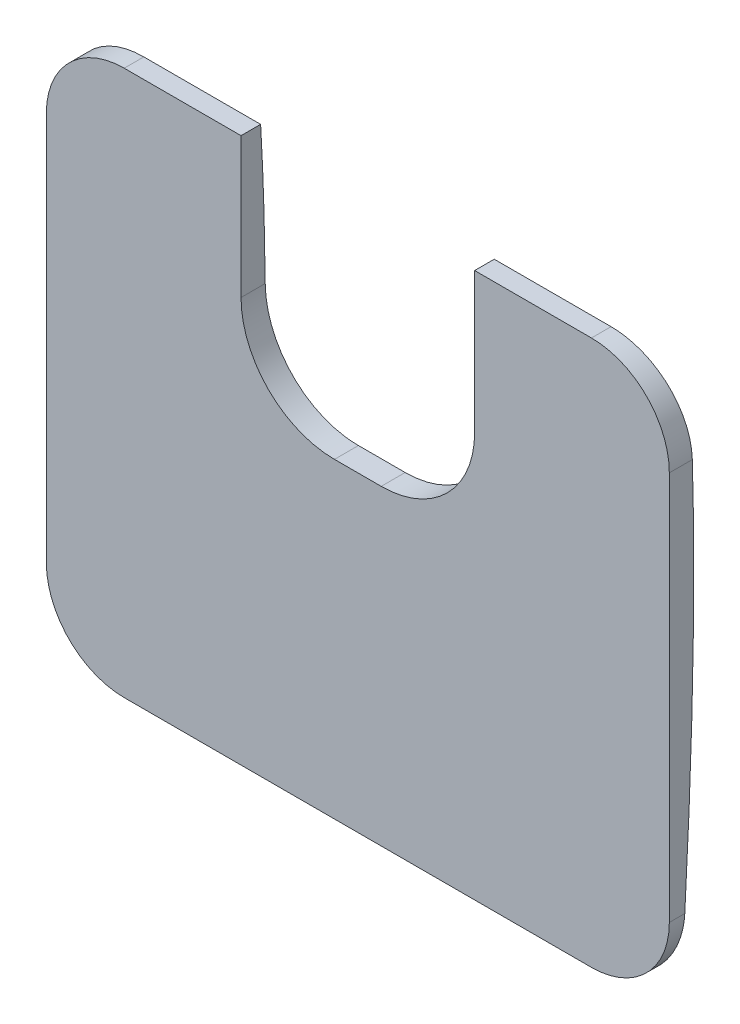
ISO-10303-21;
HEADER;
FILE_DESCRIPTION(('STEP AP214'),'2;1');
FILE_NAME('part.step','',(''),(''),'','','');
FILE_SCHEMA(('AUTOMOTIVE_DESIGN { 1 0 10303 214 1 1 1 1 }'));
ENDSEC;
DATA;
#1=APPLICATION_CONTEXT('core data for automotive mechanical design processes');
#2=APPLICATION_PROTOCOL_DEFINITION('international standard','automotive_design',2000,#1);
#3=PRODUCT_CONTEXT('',#1,'mechanical');
#4=PRODUCT('Part','Part','',(#3));
#5=PRODUCT_RELATED_PRODUCT_CATEGORY('part','',(#4));
#6=PRODUCT_DEFINITION_FORMATION('','',#4);
#7=PRODUCT_DEFINITION_CONTEXT('part definition',#1,'design');
#8=PRODUCT_DEFINITION('design','',#6,#7);
#9=PRODUCT_DEFINITION_SHAPE('','',#8);
#10=(LENGTH_UNIT() NAMED_UNIT(*) SI_UNIT(.MILLI.,.METRE.));
#11=(NAMED_UNIT(*) PLANE_ANGLE_UNIT() SI_UNIT($,.RADIAN.));
#12=(NAMED_UNIT(*) SI_UNIT($,.STERADIAN.) SOLID_ANGLE_UNIT());
#13=UNCERTAINTY_MEASURE_WITH_UNIT(LENGTH_MEASURE(1.E-05),#10,'distance_accuracy_value','');
#14=(GEOMETRIC_REPRESENTATION_CONTEXT(3) GLOBAL_UNCERTAINTY_ASSIGNED_CONTEXT((#13)) GLOBAL_UNIT_ASSIGNED_CONTEXT((#10,
#11,#12)) REPRESENTATION_CONTEXT('',''));
#15=CARTESIAN_POINT('',(0.,0.,0.));
#16=DIRECTION('',(0.,0.,1.));
#17=DIRECTION('',(1.,0.,0.));
#18=AXIS2_PLACEMENT_3D('',#15,#16,#17);
#19=CARTESIAN_POINT('',(291.807940561402,15.696584156694,-5.));
#20=DIRECTION('',(0.,1.,0.));
#21=DIRECTION('',(0.,0.,1.));
#22=AXIS2_PLACEMENT_3D('',#19,#20,#21);
#23=PLANE('',#22);
#24=DIRECTION('',(0.,0.,1.));
#25=VECTOR('',#24,1.);
#26=CARTESIAN_POINT('',(314.307940561431,15.696584156694,-26.2132034355964));
#27=LINE('',#26,#25);
#28=CARTESIAN_POINT('',(314.307940561439,15.6965841566943,-4.25834069246658));
#29=VERTEX_POINT('',#28);
#30=CARTESIAN_POINT('',(314.307940561431,15.696584156694,-3.));
#31=VERTEX_POINT('',#30);
#32=EDGE_CURVE('E153',#29,#31,#27,.T.);
#33=ORIENTED_EDGE('',*,*,#32,.T.);
#34=DIRECTION('',(-1.,-8.79666709847979E-12,0.));
#35=VECTOR('',#34,1.);
#36=CARTESIAN_POINT('',(321.807940561402,15.69658415676,-3.));
#37=LINE('',#36,#35);
#38=CARTESIAN_POINT('',(321.807940561402,15.696584156793,-3.));
#39=VERTEX_POINT('',#38);
#40=EDGE_CURVE('E136',#39,#31,#37,.T.);
#41=ORIENTED_EDGE('',*,*,#40,.F.);
#42=DIRECTION('',(0.,0.,1.));
#43=VECTOR('',#42,1.);
#44=CARTESIAN_POINT('',(321.807940561402,15.696584156694,-5.));
#45=LINE('',#44,#43);
#46=CARTESIAN_POINT('',(321.807940561402,15.6965841566951,-4.25834069246929));
#47=VERTEX_POINT('',#46);
#48=EDGE_CURVE('E173',#47,#39,#45,.T.);
#49=ORIENTED_EDGE('',*,*,#48,.F.);
#50=DIRECTION('',(1.,0.,-3.63875596320897E-13));
#51=VECTOR('',#50,1.);
#52=CARTESIAN_POINT('',(306.807940561462,15.6965841566941,-4.25834069246383));
#53=LINE('',#52,#51);
#54=EDGE_CURVE('E159',#47,#29,#53,.F.);
#55=ORIENTED_EDGE('',*,*,#54,.T.);
#56=EDGE_LOOP('',(#33,#41,#49,#55));
#57=FACE_BOUND('',#56,.T.);
#58=ADVANCED_FACE('F35',(#57),#23,.T.);
#59=DIRECTION('',(0.,0.,1.));
#60=VECTOR('',#59,1.);
#61=CARTESIAN_POINT('',(291.807940561402,15.696584156694,-5.));
#62=LINE('',#61,#60);
#63=CARTESIAN_POINT('',(291.807940561402,15.6965841566931,-4.25834069245837));
#64=VERTEX_POINT('',#63);
#65=CARTESIAN_POINT('',(291.807940561402,15.696584156694,-3.));
#66=VERTEX_POINT('',#65);
#67=EDGE_CURVE('E46',#64,#66,#62,.T.);
#68=ORIENTED_EDGE('',*,*,#67,.T.);
#69=DIRECTION('',(-1.,0.,0.));
#70=VECTOR('',#69,1.);
#71=CARTESIAN_POINT('',(299.307940561431,15.696584156694,-3.));
#72=LINE('',#71,#70);
#73=CARTESIAN_POINT('',(299.307940561431,15.696584156694,-3.));
#74=VERTEX_POINT('',#73);
#75=EDGE_CURVE('E221',#74,#66,#72,.T.);
#76=ORIENTED_EDGE('',*,*,#75,.F.);
#77=DIRECTION('',(0.,0.,1.));
#78=VECTOR('',#77,1.);
#79=CARTESIAN_POINT('',(299.307940561431,15.696584156694,-26.2132034355964));
#80=LINE('',#79,#78);
#81=CARTESIAN_POINT('',(299.307940561431,15.696584156694,-4.25834069246106));
#82=VERTEX_POINT('',#81);
#83=EDGE_CURVE('E160',#82,#74,#80,.T.);
#84=ORIENTED_EDGE('',*,*,#83,.F.);
#85=DIRECTION('',(1.,0.,-3.63875596320897E-13));
#86=VECTOR('',#85,1.);
#87=CARTESIAN_POINT('',(306.807940561462,15.6965841566941,-4.25834069246383));
#88=LINE('',#87,#86);
#89=EDGE_CURVE('E60',#82,#64,#88,.F.);
#90=ORIENTED_EDGE('',*,*,#89,.T.);
#91=EDGE_LOOP('',(#68,#76,#84,#90));
#92=FACE_BOUND('',#91,.T.);
#93=ADVANCED_FACE('F310',(#92),#23,.T.);
#94=CARTESIAN_POINT('',(321.807940561265,10.6965841566941,-5.));
#95=DIRECTION('',(0.,0.,1.));
#96=DIRECTION('',(1.,0.,0.));
#97=AXIS2_PLACEMENT_3D('',#94,#95,#96);
#98=CYLINDRICAL_SURFACE('',#97,4.99999999999995);
#99=ORIENTED_EDGE('',*,*,#48,.T.);
#100=CARTESIAN_POINT('',(321.807940561265,10.6965841566941,-3.));
#101=DIRECTION('',(0.,0.,1.));
#102=DIRECTION('',(1.,0.,0.));
#103=AXIS2_PLACEMENT_3D('',#100,#101,#102);
#104=CIRCLE('',#103,5.00000000009891);
#105=CARTESIAN_POINT('',(326.807940561397,10.6965841565873,-3.));
#106=VERTEX_POINT('',#105);
#107=EDGE_CURVE('E142',#106,#39,#104,.T.);
#108=ORIENTED_EDGE('',*,*,#107,.F.);
#109=DIRECTION('',(0.,0.,1.));
#110=VECTOR('',#109,1.);
#111=CARTESIAN_POINT('',(326.807940561397,10.6965841565873,-5.));
#112=LINE('',#111,#110);
#113=CARTESIAN_POINT('',(326.807940561397,10.6965841565873,-4.47610932860178));
#114=VERTEX_POINT('',#113);
#115=EDGE_CURVE('E175',#114,#106,#112,.T.);
#116=ORIENTED_EDGE('',*,*,#115,.F.);
#117=CARTESIAN_POINT('',(326.807940561265,10.6965841565873,-4.47610932860179));
#118=CARTESIAN_POINT('',(326.807955681955,10.8373025921257,-4.47200247518613));
#119=CARTESIAN_POINT('',(326.802000697937,10.9780139935325,-4.46773641662479));
#120=CARTESIAN_POINT('',(326.778262179565,11.2584195482503,-4.4589198899167));
#121=CARTESIAN_POINT('',(326.760479256061,11.3981137537176,-4.45436943646846));
#122=CARTESIAN_POINT('',(326.713214758485,11.6753893420703,-4.44502130149415));
#123=CARTESIAN_POINT('',(326.683742231802,11.8129722736781,-4.44022381365795));
#124=CARTESIAN_POINT('',(326.613314757692,12.085157882331,-4.43042339593424));
#125=CARTESIAN_POINT('',(326.572359938321,12.2197605925952,-4.42542046833843));
#126=CARTESIAN_POINT('',(326.479245446464,12.485070090166,-4.41526044287359));
#127=CARTESIAN_POINT('',(326.427082587139,12.6157757573454,-4.41010330151596));
#128=CARTESIAN_POINT('',(326.311909297627,12.8723711912107,-4.39969504037403));
#129=CARTESIAN_POINT('',(326.248894878895,12.9982591662617,-4.39444388667318));
#130=CARTESIAN_POINT('',(326.112515337006,13.2442102186557,-4.38391976882029));
#131=CARTESIAN_POINT('',(326.039155655271,13.3642763138712,-4.3786468175397));
#132=CARTESIAN_POINT('',(325.88255354035,13.5978434288808,-4.36814751137418));
#133=CARTESIAN_POINT('',(325.799307680356,13.7113421518598,-4.36292117332545));
#134=CARTESIAN_POINT('',(325.623529279272,13.9309413435465,-4.35259313122389));
#135=CARTESIAN_POINT('',(325.530995229563,14.0370406056509,-4.34749144758571));
#136=CARTESIAN_POINT('',(325.337307558281,14.2410663413398,-4.33749297384899));
#137=CARTESIAN_POINT('',(325.236153940331,14.3389928183599,-4.33259618366433));
#138=CARTESIAN_POINT('',(325.025905162658,14.5260104941886,-4.32308493897687));
#139=CARTESIAN_POINT('',(324.916807089316,14.6150984228844,-4.31847058921231));
#140=CARTESIAN_POINT('',(324.691516043764,14.7837328082437,-4.3096055480908));
#141=CARTESIAN_POINT('',(324.575325557532,14.8632825794963,-4.30535473055148));
#142=CARTESIAN_POINT('',(324.336631710137,15.0123133029844,-4.29728900304789));
#143=CARTESIAN_POINT('',(324.214127931951,15.0817935889249,-4.29347412193294));
#144=CARTESIAN_POINT('',(323.963732991553,15.2101578040201,-4.2863506664779));
#145=CARTESIAN_POINT('',(323.835843814635,15.2690455965548,-4.28304190760694));
#146=CARTESIAN_POINT('',(323.575578605425,15.3758180351717,-4.27699107311555));
#147=CARTESIAN_POINT('',(323.443203938469,15.4237059955723,-4.27424882682644));
#148=CARTESIAN_POINT('',(323.174931220594,15.5081451773676,-4.26938204659243));
#149=CARTESIAN_POINT('',(323.039034036675,15.5446991602314,-4.26725736218945));
#150=CARTESIAN_POINT('',(322.722347553336,15.6156939850449,-4.26311303103576));
#151=CARTESIAN_POINT('',(322.540607590983,15.6460262548773,-4.26132672180894));
#152=CARTESIAN_POINT('',(322.266542287529,15.6763571769092,-4.25953711124066));
#153=CARTESIAN_POINT('',(322.174990489759,15.6839395636655,-4.25908888534154));
#154=CARTESIAN_POINT('',(321.991613445475,15.6940524529484,-4.25849061029251));
#155=CARTESIAN_POINT('',(321.899788217687,15.6965832937884,-4.2583405411744));
#156=CARTESIAN_POINT('',(321.807940561402,15.696584156694,-4.25834069246935));
#157=B_SPLINE_CURVE_WITH_KNOTS('',3,(#117,#118,#119,#120,#121,#122,#123,#124,#125,#126,#127,
#128,#129,#130,#131,#132,#133,#134,#135,#136,#137,#138,#139,#140,#141,#142,#143,#144,#145,#146,
#147,#148,#149,#150,#151,#152,#153,#154,#155,#156),.UNSPECIFIED.,.F.,.F.,(4,2,2,2,2,2,2,2,2,2,2,
2,2,2,2,2,2,2,2,4),(0.,0.422205697908129,0.844389592788697,1.26624736611067,1.68810043482523,
2.11007361019863,2.53220221626082,2.95410961269885,3.3761636824142,3.79828641481032,
4.22040896975973,4.64268712497839,5.06481810708548,5.48697700874424,5.90898162359839,
6.33085891853793,6.7526333441844,7.30414410862671,7.57962579073973,7.85508902261871),.UNSPECIFIED.);
#158=EDGE_CURVE('E161',#114,#47,#157,.T.);
#159=ORIENTED_EDGE('',*,*,#158,.T.);
#160=EDGE_LOOP('',(#99,#108,#116,#159));
#161=FACE_BOUND('',#160,.T.);
#162=ADVANCED_FACE('F316',(#161),#98,.T.);
#163=CARTESIAN_POINT('',(326.807940561397,10.6965841565873,-5.));
#164=DIRECTION('',(1.,0.,0.));
#165=DIRECTION('',(0.,0.,-1.));
#166=AXIS2_PLACEMENT_3D('',#163,#164,#165);
#167=PLANE('',#166);
#168=ORIENTED_EDGE('',*,*,#115,.T.);
#169=DIRECTION('',(0.,1.,0.));
#170=VECTOR('',#169,1.);
#171=CARTESIAN_POINT('',(326.807940561397,-14.3034158434079,-3.));
#172=LINE('',#171,#170);
#173=CARTESIAN_POINT('',(326.807940561397,-14.3034158434079,-3.));
#174=VERTEX_POINT('',#173);
#175=EDGE_CURVE('E238',#174,#106,#172,.T.);
#176=ORIENTED_EDGE('',*,*,#175,.F.);
#177=DIRECTION('',(0.,0.,1.));
#178=VECTOR('',#177,1.);
#179=CARTESIAN_POINT('',(326.807940561397,-14.3034158434079,-5.));
#180=LINE('',#179,#178);
#181=CARTESIAN_POINT('',(326.807940561397,-14.3034158434079,-3.99279363601595));
#182=VERTEX_POINT('',#181);
#183=EDGE_CURVE('E178',#182,#174,#180,.T.);
#184=ORIENTED_EDGE('',*,*,#183,.F.);
#185=CARTESIAN_POINT('',(326.807940561401,-36.0189411442895,-2.36233348947626));
#186=CARTESIAN_POINT('',(326.807940561401,-33.8174655472411,-2.5640594077421));
#187=CARTESIAN_POINT('',(326.8079405614,-28.3807282534533,-3.03835451507526));
#188=CARTESIAN_POINT('',(326.807940561399,-19.7070258289108,-3.6921119697029));
#189=CARTESIAN_POINT('',(326.807940561398,-9.99924832097791,-4.24869143122706));
#190=CARTESIAN_POINT('',(326.807940561398,-0.295866356779825,-4.57603342067714));
#191=CARTESIAN_POINT('',(326.807940561397,7.77491004750242,-4.58425567657189));
#192=CARTESIAN_POINT('',(326.807940561397,14.2071720681441,-4.36336944783123));
#193=CARTESIAN_POINT('',(326.807940561397,19.0074377170733,-4.05350743605976));
#194=CARTESIAN_POINT('',(326.807940561396,22.975407380882,-3.64274931501332));
#195=CARTESIAN_POINT('',(326.807940561396,26.1109681812323,-3.1878234741688));
#196=CARTESIAN_POINT('',(326.807940561396,28.4294029067618,-2.76888768837752));
#197=CARTESIAN_POINT('',(326.807940561396,30.7004759910017,-2.25200999653488));
#198=CARTESIAN_POINT('',(326.807940561396,32.5183143699654,-1.71445781541652));
#199=CARTESIAN_POINT('',(326.807940561396,33.7637393630606,-1.23759557341227));
#200=CARTESIAN_POINT('',(326.807940561397,34.291166311014,-0.996644738967104));
#201=CARTESIAN_POINT('',(326.807940561397,34.4946850505463,-0.895432675926265));
#202=B_SPLINE_CURVE_WITH_KNOTS('',3,(#185,#186,#187,#188,#189,#190,#191,#192,#193,#194,#195,
#196,#197,#198,#199,#200,#201),.UNSPECIFIED.,.F.,.F.,(4,1,1,1,1,1,1,1,1,1,1,1,1,1,4),
(0.514345279864183,0.543338481354267,0.585917218611175,0.628495955868082,0.67107469312499,
0.713653430381897,0.734942799010351,0.756232167638805,0.777521536267259,0.788166220581485,
0.798810904895712,0.809455589209939,0.820100273524166,0.82542261568128,0.829038536987228),.UNSPECIFIED.);
#203=EDGE_CURVE('E167',#182,#114,#202,.T.);
#204=ORIENTED_EDGE('',*,*,#203,.T.);
#205=EDGE_LOOP('',(#168,#176,#184,#204));
#206=FACE_BOUND('',#205,.T.);
#207=ADVANCED_FACE('F323',(#206),#167,.T.);
#208=CARTESIAN_POINT('',(321.80794056143,-14.3034158434079,-5.));
#209=DIRECTION('',(0.,0.,1.));
#210=DIRECTION('',(1.,0.,0.));
#211=AXIS2_PLACEMENT_3D('',#208,#209,#210);
#212=CYLINDRICAL_SURFACE('',#211,4.99999999996626);
#213=ORIENTED_EDGE('',*,*,#183,.T.);
#214=CARTESIAN_POINT('',(321.80794056143,-14.3034158434079,-3.));
#215=DIRECTION('',(0.,0.,1.));
#216=DIRECTION('',(1.,0.,0.));
#217=AXIS2_PLACEMENT_3D('',#214,#215,#216);
#218=CIRCLE('',#217,4.99999999996626);
#219=CARTESIAN_POINT('',(321.807940561431,-19.3034158433742,-3.));
#220=VERTEX_POINT('',#219);
#221=EDGE_CURVE('E236',#220,#174,#218,.T.);
#222=ORIENTED_EDGE('',*,*,#221,.F.);
#223=DIRECTION('',(0.,0.,1.));
#224=VECTOR('',#223,1.);
#225=CARTESIAN_POINT('',(321.807940561431,-19.3034158433742,-5.));
#226=LINE('',#225,#224);
#227=CARTESIAN_POINT('',(321.807940561431,-19.3034158433731,-3.68955676077569));
#228=VERTEX_POINT('',#227);
#229=EDGE_CURVE('E181',#228,#220,#226,.T.);
#230=ORIENTED_EDGE('',*,*,#229,.F.);
#231=CARTESIAN_POINT('',(321.807940561431,-19.3034158433742,-3.68955676077562));
#232=CARTESIAN_POINT('',(321.94836098713,-19.3034311239914,-3.68955533920949));
#233=CARTESIAN_POINT('',(322.088779115145,-19.2975011181623,-3.6899447399878));
#234=CARTESIAN_POINT('',(322.368608829737,-19.273860977636,-3.69149491474282));
#235=CARTESIAN_POINT('',(322.508020469063,-19.2561514648945,-3.6926556479933));
#236=CARTESIAN_POINT('',(322.784736612698,-19.2090820707162,-3.69573695230666));
#237=CARTESIAN_POINT('',(322.922042753621,-19.1797317700553,-3.69765689850685));
#238=CARTESIAN_POINT('',(323.193688564898,-19.1095969602916,-3.70223659090465));
#239=CARTESIAN_POINT('',(323.328028268651,-19.0688125799905,-3.70489632876872));
#240=CARTESIAN_POINT('',(323.5928262627,-18.9760883357394,-3.71092957633759));
#241=CARTESIAN_POINT('',(323.723283466714,-18.9241453825308,-3.71430328370148));
#242=CARTESIAN_POINT('',(323.979400267755,-18.8094625377062,-3.72173133795077));
#243=CARTESIAN_POINT('',(324.105058073767,-18.7467186626385,-3.72578593593962));
#244=CARTESIAN_POINT('',(324.350570398726,-18.6109327341103,-3.73453200044621));
#245=CARTESIAN_POINT('',(324.470427944529,-18.5378961314698,-3.73922312982127));
#246=CARTESIAN_POINT('',(324.703607409246,-18.3819928477441,-3.7491992799403));
#247=CARTESIAN_POINT('',(324.81692690136,-18.2991225510264,-3.75448451908745));
#248=CARTESIAN_POINT('',(325.03625415778,-18.1241078917265,-3.76559932814451));
#249=CARTESIAN_POINT('',(325.142257141034,-18.0319575599136,-3.77142924823507));
#250=CARTESIAN_POINT('',(325.346161583107,-17.8390483346421,-3.78357639899047));
#251=CARTESIAN_POINT('',(325.444060011119,-17.738286249074,-3.78989381026815));
#252=CARTESIAN_POINT('',(325.631006559448,-17.5289172333644,-3.80295278340061));
#253=CARTESIAN_POINT('',(325.720056130414,-17.4203115941243,-3.80969427543622));
#254=CARTESIAN_POINT('',(325.888727351489,-17.1959719712,-3.82354173596361));
#255=CARTESIAN_POINT('',(325.968345630918,-17.0802354613207,-3.83064783347035));
#256=CARTESIAN_POINT('',(326.117705749165,-16.8422538411673,-3.84517148887448));
#257=CARTESIAN_POINT('',(326.187427751512,-16.7199963160121,-3.8525896347424));
#258=CARTESIAN_POINT('',(326.316316769331,-16.4700530415555,-3.86765736320167));
#259=CARTESIAN_POINT('',(326.375483721156,-16.3423672595277,-3.87530694718825));
#260=CARTESIAN_POINT('',(326.482820831575,-16.0825279613778,-3.89076715964966));
#261=CARTESIAN_POINT('',(326.530996086842,-15.9503765486668,-3.89857771164687));
#262=CARTESIAN_POINT('',(326.616034441386,-15.6825402338636,-3.9142936605079));
#263=CARTESIAN_POINT('',(326.65289995549,-15.5468560927921,-3.92219903674999));
#264=CARTESIAN_POINT('',(326.725157218754,-15.2283788872064,-3.94061440387321));
#265=CARTESIAN_POINT('',(326.756198733006,-15.0445705214651,-3.95113814295161));
#266=CARTESIAN_POINT('',(326.787239468751,-14.767351015527,-3.96684363805454));
#267=CARTESIAN_POINT('',(326.794999450839,-14.6747396394934,-3.97206288318052));
#268=CARTESIAN_POINT('',(326.805349342046,-14.4892323760307,-3.98246161193553));
#269=CARTESIAN_POINT('',(326.807939594775,-14.3963365079216,-3.98764109818437));
#270=CARTESIAN_POINT('',(326.807940561397,-14.3034158434079,-3.99279363601595));
#271=B_SPLINE_CURVE_WITH_KNOTS('',3,(#231,#232,#233,#234,#235,#236,#237,#238,#239,#240,#241,
#242,#243,#244,#245,#246,#247,#248,#249,#250,#251,#252,#253,#254,#255,#256,#257,#258,#259,#260,
#261,#262,#263,#264,#265,#266,#267,#268,#269,#270),.UNSPECIFIED.,.F.,.F.,(4,2,2,2,2,2,2,2,2,2,2,
2,2,2,2,2,2,2,2,4),(0.,0.421132316312632,0.842242398679262,1.26300660954154,1.68376608079933,
2.10464219007426,2.52567385512012,2.94648338241516,3.36744811431801,3.78868537574154,
4.21007945959485,4.63140434726126,5.05287936215348,5.4751876148785,5.89749841401181,
6.31961299460281,6.74163738353355,7.3004432741648,7.57956959893323,7.85867737077976),.UNSPECIFIED.);
#272=EDGE_CURVE('E331',#228,#182,#271,.T.);
#273=ORIENTED_EDGE('',*,*,#272,.T.);
#274=EDGE_LOOP('',(#213,#222,#230,#273));
#275=FACE_BOUND('',#274,.T.);
#276=ADVANCED_FACE('F326',(#275),#212,.T.);
#277=CARTESIAN_POINT('',(291.807940561431,-19.3034158433742,-5.));
#278=DIRECTION('',(0.,-1.,0.));
#279=DIRECTION('',(0.,0.,-1.));
#280=AXIS2_PLACEMENT_3D('',#277,#278,#279);
#281=PLANE('',#280);
#282=ORIENTED_EDGE('',*,*,#229,.T.);
#283=DIRECTION('',(1.,0.,0.));
#284=VECTOR('',#283,1.);
#285=CARTESIAN_POINT('',(291.807940561431,-19.3034158433742,-3.));
#286=LINE('',#285,#284);
#287=CARTESIAN_POINT('',(291.807940561431,-19.3034158433742,-3.));
#288=VERTEX_POINT('',#287);
#289=EDGE_CURVE('E234',#288,#220,#286,.T.);
#290=ORIENTED_EDGE('',*,*,#289,.F.);
#291=DIRECTION('',(0.,0.,1.));
#292=VECTOR('',#291,1.);
#293=CARTESIAN_POINT('',(291.807940561431,-19.3034158433742,-5.));
#294=LINE('',#293,#292);
#295=CARTESIAN_POINT('',(291.807940561431,-19.3034158433742,-3.68955676076484));
#296=VERTEX_POINT('',#295);
#297=EDGE_CURVE('E184',#296,#288,#294,.T.);
#298=ORIENTED_EDGE('',*,*,#297,.F.);
#299=DIRECTION('',(1.,0.,-3.63875596320897E-13));
#300=VECTOR('',#299,1.);
#301=CARTESIAN_POINT('',(306.807940561464,-19.3034158433742,-3.68955676077023));
#302=LINE('',#301,#300);
#303=EDGE_CURVE('E292',#296,#228,#302,.T.);
#304=ORIENTED_EDGE('',*,*,#303,.T.);
#305=EDGE_LOOP('',(#282,#290,#298,#304));
#306=FACE_BOUND('',#305,.T.);
#307=ADVANCED_FACE('F301',(#306),#281,.T.);
#308=CARTESIAN_POINT('',(291.80794056143,-14.3034158433337,-5.));
#309=DIRECTION('',(0.,0.,1.));
#310=DIRECTION('',(1.,0.,0.));
#311=AXIS2_PLACEMENT_3D('',#308,#309,#310);
#312=CYLINDRICAL_SURFACE('',#311,5.00000000004052);
#313=ORIENTED_EDGE('',*,*,#297,.T.);
#314=CARTESIAN_POINT('',(291.80794056143,-14.3034158433337,-3.));
#315=DIRECTION('',(0.,0.,1.));
#316=DIRECTION('',(1.,0.,0.));
#317=AXIS2_PLACEMENT_3D('',#314,#315,#316);
#318=CIRCLE('',#317,5.00000000004052);
#319=CARTESIAN_POINT('',(286.80794056139,-14.3034158433629,-3.));
#320=VERTEX_POINT('',#319);
#321=EDGE_CURVE('E232',#320,#288,#318,.T.);
#322=ORIENTED_EDGE('',*,*,#321,.F.);
#323=DIRECTION('',(0.,0.,1.));
#324=VECTOR('',#323,1.);
#325=CARTESIAN_POINT('',(286.80794056139,-14.3034158433629,-5.));
#326=LINE('',#325,#324);
#327=CARTESIAN_POINT('',(286.80794056139,-14.303415833687,-3.99279363654058));
#328=VERTEX_POINT('',#327);
#329=EDGE_CURVE('E187',#328,#320,#326,.T.);
#330=ORIENTED_EDGE('',*,*,#329,.F.);
#331=CARTESIAN_POINT('',(286.80794056139,-14.3034158433629,-3.99279363600404));
#332=CARTESIAN_POINT('',(286.807925562334,-14.4442523615923,-3.98498466726833));
#333=CARTESIAN_POINT('',(286.813890406568,-14.585082971853,-3.97711001647148));
#334=CARTESIAN_POINT('',(286.837669575156,-14.8657298767975,-3.96129106787373));
#335=CARTESIAN_POINT('',(286.855483336385,-15.0055462193656,-3.95334677340039));
#336=CARTESIAN_POINT('',(286.902833059134,-15.2830754787565,-3.93745523740906));
#337=CARTESIAN_POINT('',(286.932360551218,-15.4207898408381,-3.92950800215605));
#338=CARTESIAN_POINT('',(287.002923478264,-15.6932394681444,-3.91366945234413));
#339=CARTESIAN_POINT('',(287.043958774994,-15.8279747691329,-3.90577813711468));
#340=CARTESIAN_POINT('',(287.137262934718,-16.0935517393583,-3.8901149815633));
#341=CARTESIAN_POINT('',(287.189535234996,-16.2243922032311,-3.88234317858014));
#342=CARTESIAN_POINT('',(287.304957602125,-16.4812534271177,-3.86698586731402));
#343=CARTESIAN_POINT('',(287.368111668704,-16.607272394043,-3.85940042870711));
#344=CARTESIAN_POINT('',(287.504800973935,-16.8534754601292,-3.84449027049305));
#345=CARTESIAN_POINT('',(287.578330593902,-16.9736626703374,-3.83716541244399));
#346=CARTESIAN_POINT('',(287.735304510557,-17.20745920019,-3.82283627670485));
#347=CARTESIAN_POINT('',(287.818752240965,-17.3210662213621,-3.81583211121013));
#348=CARTESIAN_POINT('',(287.994895692875,-17.5407760387314,-3.80221658227124));
#349=CARTESIAN_POINT('',(288.087585532953,-17.6468835348678,-3.79560497323575));
#350=CARTESIAN_POINT('',(288.281601141313,-17.8509146711143,-3.78283243097442));
#351=CARTESIAN_POINT('',(288.382926896283,-17.94883832384,-3.77667149705385));
#352=CARTESIAN_POINT('',(288.593535178636,-18.1358349437969,-3.76485752195503));
#353=CARTESIAN_POINT('',(288.70282062569,-18.2249046347143,-3.75920466886024));
#354=CARTESIAN_POINT('',(288.928499089285,-18.3934827535134,-3.74846666701309));
#355=CARTESIAN_POINT('',(289.044889604807,-18.4729945169015,-3.74338132025814));
#356=CARTESIAN_POINT('',(289.283852986101,-18.6218384757771,-3.73383176821649));
#357=CARTESIAN_POINT('',(289.406418880877,-18.6911818185368,-3.72936688302561));
#358=CARTESIAN_POINT('',(289.656931832521,-18.8192708660216,-3.72109781600739));
#359=CARTESIAN_POINT('',(289.784876899454,-18.8780204479234,-3.71729339247888));
#360=CARTESIAN_POINT('',(290.045245523601,-18.984513863245,-3.71038269270915));
#361=CARTESIAN_POINT('',(290.177667684246,-19.0322610930313,-3.70727620102757));
#362=CARTESIAN_POINT('',(290.4460267243,-19.1164162569944,-3.70179221242807));
#363=CARTESIAN_POINT('',(290.581962731077,-19.1528269777446,-3.69941453636568));
#364=CARTESIAN_POINT('',(290.897865239436,-19.2232961508283,-3.6948079209061));
#365=CARTESIAN_POINT('',(291.07875668208,-19.2533398309533,-3.69283968483182));
#366=CARTESIAN_POINT('',(291.35152765847,-19.2833818190595,-3.6908706481328));
#367=CARTESIAN_POINT('',(291.442643902325,-19.2908918862931,-3.69037818970625));
#368=CARTESIAN_POINT('',(291.625146270998,-19.3009083187792,-3.68972125682674));
#369=CARTESIAN_POINT('',(291.71653237787,-19.3034150095671,-3.6895567610355));
#370=CARTESIAN_POINT('',(291.807940561431,-19.3034158433742,-3.68955676076484));
#371=B_SPLINE_CURVE_WITH_KNOTS('',3,(#331,#332,#333,#334,#335,#336,#337,#338,#339,#340,#341,
#342,#343,#344,#345,#346,#347,#348,#349,#350,#351,#352,#353,#354,#355,#356,#357,#358,#359,#360,
#361,#362,#363,#364,#365,#366,#367,#368,#369,#370),.UNSPECIFIED.,.F.,.F.,(4,2,2,2,2,2,2,2,2,2,2,
2,2,2,2,2,2,2,2,4),(0.,0.423029269431222,0.846038435633772,1.26874230722951,1.69144110150882,
2.11426937949426,2.53725340610167,2.96000924653474,3.38291187671018,3.80554708037446,
4.228181632524,4.65097199839562,5.07361438872738,5.49578993093506,5.91781064747426,
6.33970091345987,6.76148739457934,7.3103686804158,7.58453250565308,7.85867849235627),.UNSPECIFIED.);
#372=EDGE_CURVE('E284',#328,#296,#371,.T.);
#373=ORIENTED_EDGE('',*,*,#372,.T.);
#374=EDGE_LOOP('',(#313,#322,#330,#373));
#375=FACE_BOUND('',#374,.T.);
#376=ADVANCED_FACE('F296',(#375),#312,.T.);
#377=CARTESIAN_POINT('',(286.80794056139,-14.3034158433629,-5.));
#378=DIRECTION('',(-1.,0.,0.));
#379=DIRECTION('',(0.,-1.,0.));
#380=AXIS2_PLACEMENT_3D('',#377,#378,#379);
#381=PLANE('',#380);
#382=ORIENTED_EDGE('',*,*,#329,.T.);
#383=DIRECTION('',(-1.82076576038348E-13,-1.,0.));
#384=VECTOR('',#383,1.);
#385=CARTESIAN_POINT('',(286.807940561395,10.6965841566615,-3.));
#386=LINE('',#385,#384);
#387=CARTESIAN_POINT('',(286.807940561397,10.6965841566615,-3.));
#388=VERTEX_POINT('',#387);
#389=EDGE_CURVE('E230',#388,#320,#386,.T.);
#390=ORIENTED_EDGE('',*,*,#389,.F.);
#391=DIRECTION('',(0.,0.,1.));
#392=VECTOR('',#391,1.);
#393=CARTESIAN_POINT('',(286.80794056139,10.6965841566615,-5.));
#394=LINE('',#393,#392);
#395=CARTESIAN_POINT('',(286.80794056139,10.6965841566615,-4.47610932858498));
#396=VERTEX_POINT('',#395);
#397=EDGE_CURVE('E189',#396,#388,#394,.T.);
#398=ORIENTED_EDGE('',*,*,#397,.F.);
#399=CARTESIAN_POINT('',(286.807940561392,-36.0189411442922,-2.36233348946171));
#400=CARTESIAN_POINT('',(286.807940561392,-33.8174655472438,-2.56405940772755));
#401=CARTESIAN_POINT('',(286.807940561392,-28.380728253456,-3.0383545150607));
#402=CARTESIAN_POINT('',(286.807940561391,-19.7070258289135,-3.69211196968835));
#403=CARTESIAN_POINT('',(286.80794056139,-9.9992483209806,-4.2486914312125));
#404=CARTESIAN_POINT('',(286.807940561389,-0.295866356782511,-4.57603342066259));
#405=CARTESIAN_POINT('',(286.807940561389,7.77491004749974,-4.58425567655734));
#406=CARTESIAN_POINT('',(286.807940561388,14.2071720681414,-4.36336944781667));
#407=CARTESIAN_POINT('',(286.807940561388,19.0074377170706,-4.0535074360452));
#408=CARTESIAN_POINT('',(286.807940561388,22.9754073808794,-3.64274931499877));
#409=CARTESIAN_POINT('',(286.807940561388,26.1109681812296,-3.18782347415424));
#410=CARTESIAN_POINT('',(286.807940561388,28.4294029067591,-2.76888768836297));
#411=CARTESIAN_POINT('',(286.807940561388,30.700475990999,-2.25200999652033));
#412=CARTESIAN_POINT('',(286.807940561388,32.5183143699627,-1.71445781540196));
#413=CARTESIAN_POINT('',(286.807940561388,33.7637393630579,-1.23759557339772));
#414=CARTESIAN_POINT('',(286.807940561388,34.2911663110113,-0.996644738952549));
#415=CARTESIAN_POINT('',(286.807940561388,34.4946850505437,-0.895432675911709));
#416=B_SPLINE_CURVE_WITH_KNOTS('',3,(#399,#400,#401,#402,#403,#404,#405,#406,#407,#408,#409,
#410,#411,#412,#413,#414,#415),.UNSPECIFIED.,.F.,.F.,(4,1,1,1,1,1,1,1,1,1,1,1,1,1,4),
(0.514345279864183,0.543338481354267,0.585917218611175,0.628495955868082,0.67107469312499,
0.713653430381897,0.734942799010351,0.756232167638805,0.777521536267259,0.788166220581485,
0.798810904895712,0.809455589209939,0.820100273524166,0.82542261568128,0.829038536987228),.UNSPECIFIED.);
#417=EDGE_CURVE('E293',#396,#328,#416,.F.);
#418=ORIENTED_EDGE('',*,*,#417,.T.);
#419=EDGE_LOOP('',(#382,#390,#398,#418));
#420=FACE_BOUND('',#419,.T.);
#421=ADVANCED_FACE('F300',(#420),#381,.T.);
#422=CARTESIAN_POINT('',(291.807940561427,10.6965841566663,-5.));
#423=DIRECTION('',(0.,0.,1.));
#424=DIRECTION('',(1.,0.,0.));
#425=AXIS2_PLACEMENT_3D('',#422,#423,#424);
#426=CYLINDRICAL_SURFACE('',#425,5.0000000000377);
#427=ORIENTED_EDGE('',*,*,#397,.T.);
#428=CARTESIAN_POINT('',(291.807940561427,10.6965841566663,-3.));
#429=DIRECTION('',(0.,0.,1.));
#430=DIRECTION('',(1.,0.,0.));
#431=AXIS2_PLACEMENT_3D('',#428,#429,#430);
#432=CIRCLE('',#431,5.0000000000302);
#433=EDGE_CURVE('E223',#66,#388,#432,.T.);
#434=ORIENTED_EDGE('',*,*,#433,.F.);
#435=ORIENTED_EDGE('',*,*,#67,.F.);
#436=CARTESIAN_POINT('',(291.807940561402,15.696584156704,-4.25834069245773));
#437=CARTESIAN_POINT('',(291.667460444572,15.6965994116354,-4.25833827422507));
#438=CARTESIAN_POINT('',(291.526982641611,15.6906644002865,-4.25869112297151));
#439=CARTESIAN_POINT('',(291.247034103448,15.6670041200474,-4.26008985314373));
#440=CARTESIAN_POINT('',(291.10756331508,15.6492794782652,-4.26113569770802));
#441=CARTESIAN_POINT('',(290.830729483677,15.602169486965,-4.26390178869041));
#442=CARTESIAN_POINT('',(290.693364808185,15.5727936980069,-4.26562148215568));
#443=CARTESIAN_POINT('',(290.421603175338,15.5025971634338,-4.26970148425843));
#444=CARTESIAN_POINT('',(290.287206184966,15.4617765452198,-4.27206178576481));
#445=CARTESIAN_POINT('',(290.022295406995,15.3689684910397,-4.27737919900762));
#446=CARTESIAN_POINT('',(289.891782699458,15.3169779816051,-4.2803364749919));
#447=CARTESIAN_POINT('',(289.635556784327,15.2021876618635,-4.28679345062171));
#448=CARTESIAN_POINT('',(289.509845368768,15.1393838628577,-4.29029335037731));
#449=CARTESIAN_POINT('',(289.264228070374,15.0034643509508,-4.29776897386797));
#450=CARTESIAN_POINT('',(289.144319171027,14.9303540750702,-4.30174444655561));
#451=CARTESIAN_POINT('',(288.911040382865,14.7742882281926,-4.31010372212206));
#452=CARTESIAN_POINT('',(288.797672921872,14.6913290363017,-4.3144876750479));
#453=CARTESIAN_POINT('',(288.578259537707,14.5161236773043,-4.32359008130582));
#454=CARTESIAN_POINT('',(288.472218062716,14.4238719500801,-4.32830873439772));
#455=CARTESIAN_POINT('',(288.268242811372,14.2307422528196,-4.33800200036791));
#456=CARTESIAN_POINT('',(288.170312069627,14.1298610825404,-4.34297670792963));
#457=CARTESIAN_POINT('',(287.983309971183,13.9202351554808,-4.35310043985928));
#458=CARTESIAN_POINT('',(287.894237153793,13.8114917003323,-4.35824943529844));
#459=CARTESIAN_POINT('',(287.725531873513,13.5868569899373,-4.36864595292859));
#460=CARTESIAN_POINT('',(287.645902782037,13.4709632043331,-4.37389350953613));
#461=CARTESIAN_POINT('',(287.496587798291,13.2327279408307,-4.38441671790569));
#462=CARTESIAN_POINT('',(287.4269150002,13.1103782565412,-4.38969239737058));
#463=CARTESIAN_POINT('',(287.298130839467,12.8602399984893,-4.40019375845359));
#464=CARTESIAN_POINT('',(287.239019526468,12.7324513991661,-4.40541943983659));
#465=CARTESIAN_POINT('',(287.131804454094,12.472398753768,-4.41575324294306));
#466=CARTESIAN_POINT('',(287.0836954324,12.3401368821222,-4.42086141981216));
#467=CARTESIAN_POINT('',(286.998802749636,12.0720726201526,-4.43090304213641));
#468=CARTESIAN_POINT('',(286.962016637867,11.9362710028725,-4.43583652519691));
#469=CARTESIAN_POINT('',(286.890139730486,11.6183005182746,-4.44701825831081));
#470=CARTESIAN_POINT('',(286.859317950923,11.4351355382199,-4.45318498772245));
#471=CARTESIAN_POINT('',(286.828496226393,11.1588893919322,-4.46206800230606));
#472=CARTESIAN_POINT('',(286.820790816449,11.0666033928661,-4.46496648966706));
#473=CARTESIAN_POINT('',(286.810513610784,10.8817479638742,-4.47063549142784));
#474=CARTESIAN_POINT('',(286.80794148684,10.789178552449,-4.47340601399865));
#475=CARTESIAN_POINT('',(286.80794056139,10.6965841566615,-4.47610932858498));
#476=B_SPLINE_CURVE_WITH_KNOTS('',3,(#436,#437,#438,#439,#440,#441,#442,#443,#444,#445,#446,
#447,#448,#449,#450,#451,#452,#453,#454,#455,#456,#457,#458,#459,#460,#461,#462,#463,#464,#465,
#466,#467,#468,#469,#470,#471,#472,#473,#474,#475),.UNSPECIFIED.,.F.,.F.,(4,2,2,2,2,2,2,2,2,2,2,
2,2,2,2,2,2,2,2,4),(0.,0.421311302490336,0.842600196603901,1.26354410733069,1.68448333240043,
2.10553853031835,2.52674937694532,2.9477388461614,3.36888357169309,3.79028179991053,
4.21183698753748,4.63332254416081,5.05495812117617,5.4771432137871,5.89933029071985,
6.32131501423014,6.74320834028525,7.29943089490219,7.57726857755585,7.85508849463401),.UNSPECIFIED.);
#477=EDGE_CURVE('E276',#64,#396,#476,.T.);
#478=ORIENTED_EDGE('',*,*,#477,.T.);
#479=EDGE_LOOP('',(#427,#434,#435,#478));
#480=FACE_BOUND('',#479,.T.);
#481=ADVANCED_FACE('F37',(#480),#426,.T.);
#482=CARTESIAN_POINT('',(314.307940561431,15.696584156694,-26.2132034355964));
#483=DIRECTION('',(1.,0.,0.));
#484=DIRECTION('',(0.,0.,-1.));
#485=AXIS2_PLACEMENT_3D('',#482,#483,#484);
#486=PLANE('',#485);
#487=DIRECTION('',(0.,-1.,0.));
#488=VECTOR('',#487,1.);
#489=CARTESIAN_POINT('',(314.307940561431,15.696584156694,-3.));
#490=LINE('',#489,#488);
#491=CARTESIAN_POINT('',(314.307940561431,6.69658415669404,-3.));
#492=VERTEX_POINT('',#491);
#493=EDGE_CURVE('E139',#31,#492,#490,.T.);
#494=ORIENTED_EDGE('',*,*,#493,.F.);
#495=ORIENTED_EDGE('',*,*,#32,.F.);
#496=CARTESIAN_POINT('',(314.307940561443,-36.0189411442904,-2.36233348947171));
#497=CARTESIAN_POINT('',(314.307940561443,-33.817465547242,-2.56405940773755));
#498=CARTESIAN_POINT('',(314.307940561442,-28.3807282534542,-3.03835451507071));
#499=CARTESIAN_POINT('',(314.307940561441,-19.7070258289116,-3.69211196969835));
#500=CARTESIAN_POINT('',(314.30794056144,-9.99924832097875,-4.24869143122251));
#501=CARTESIAN_POINT('',(314.30794056144,-0.295866356780665,-4.57603342067259));
#502=CARTESIAN_POINT('',(314.307940561439,7.77491004750158,-4.58425567656735));
#503=CARTESIAN_POINT('',(314.307940561439,14.2071720681432,-4.36336944782668));
#504=CARTESIAN_POINT('',(314.307940561438,19.0074377170724,-4.05350743605521));
#505=CARTESIAN_POINT('',(314.307940561438,22.9754073808812,-3.64274931500878));
#506=CARTESIAN_POINT('',(314.307940561438,26.1109681812314,-3.18782347416425));
#507=CARTESIAN_POINT('',(314.307940561438,28.4294029067609,-2.76888768837297));
#508=CARTESIAN_POINT('',(314.307940561438,30.7004759910009,-2.25200999653034));
#509=CARTESIAN_POINT('',(314.307940561438,32.5183143699646,-1.71445781541197));
#510=CARTESIAN_POINT('',(314.307940561438,33.7637393630598,-1.23759557340773));
#511=CARTESIAN_POINT('',(314.307940561439,34.2911663110132,-0.996644738962556));
#512=CARTESIAN_POINT('',(314.307940561438,34.4946850505455,-0.895432675921716));
#513=B_SPLINE_CURVE_WITH_KNOTS('',3,(#496,#497,#498,#499,#500,#501,#502,#503,#504,#505,#506,
#507,#508,#509,#510,#511,#512),.UNSPECIFIED.,.F.,.F.,(4,1,1,1,1,1,1,1,1,1,1,1,1,1,4),
(0.514345279864183,0.543338481354267,0.585917218611175,0.628495955868082,0.67107469312499,
0.713653430381897,0.734942799010351,0.756232167638805,0.777521536267259,0.788166220581485,
0.798810904895712,0.809455589209939,0.820100273524166,0.82542261568128,0.829038536987228),.UNSPECIFIED.);
#514=CARTESIAN_POINT('',(314.307940561431,6.69658415669403,-4.55345325608141));
#515=VERTEX_POINT('',#514);
#516=EDGE_CURVE('E346',#515,#29,#513,.T.);
#517=ORIENTED_EDGE('',*,*,#516,.F.);
#518=DIRECTION('',(0.,0.,1.));
#519=VECTOR('',#518,1.);
#520=CARTESIAN_POINT('',(314.307940561431,6.69658415669404,-26.2132034355964));
#521=LINE('',#520,#519);
#522=EDGE_CURVE('E155',#515,#492,#521,.T.);
#523=ORIENTED_EDGE('',*,*,#522,.T.);
#524=EDGE_LOOP('',(#494,#495,#517,#523));
#525=FACE_BOUND('',#524,.T.);
#526=ADVANCED_FACE('F151',(#525),#486,.F.);
#527=CARTESIAN_POINT('',(308.307940561431,6.69658415669404,-26.2132034355964));
#528=DIRECTION('',(0.,0.,1.));
#529=DIRECTION('',(1.,0.,0.));
#530=AXIS2_PLACEMENT_3D('',#527,#528,#529);
#531=CYLINDRICAL_SURFACE('',#530,6.);
#532=CARTESIAN_POINT('',(308.307940561431,6.69658415669404,-3.));
#533=DIRECTION('',(0.,0.,-1.));
#534=DIRECTION('',(1.,0.,0.));
#535=AXIS2_PLACEMENT_3D('',#532,#533,#534);
#536=CIRCLE('',#535,6.);
#537=CARTESIAN_POINT('',(308.307940561431,0.696584156694035,-3.));
#538=VERTEX_POINT('',#537);
#539=EDGE_CURVE('E156',#492,#538,#536,.T.);
#540=ORIENTED_EDGE('',*,*,#539,.F.);
#541=ORIENTED_EDGE('',*,*,#522,.F.);
#542=CARTESIAN_POINT('',(308.307940561431,0.696584156694038,-4.53873800949188));
#543=CARTESIAN_POINT('',(308.47668969359,0.696566000603366,-4.53873661596602));
#544=CARTESIAN_POINT('',(308.645436205813,0.703702461748274,-4.53883732310639));
#545=CARTESIAN_POINT('',(308.981721694945,0.732153474511467,-4.5392328833444));
#546=CARTESIAN_POINT('',(309.149260729914,0.753467339758828,-4.53952772704331));
#547=CARTESIAN_POINT('',(309.481819073112,0.810120496195372,-4.54030121269272));
#548=CARTESIAN_POINT('',(309.646840200178,0.845449111938435,-4.5407797147363));
#549=CARTESIAN_POINT('',(309.973319211074,0.929874652394632,-4.54190095873989));
#550=CARTESIAN_POINT('',(310.134777138033,0.978971410365593,-4.54254369871085));
#551=CARTESIAN_POINT('',(310.453032768466,1.09060287369794,-4.54396760601445));
#552=CARTESIAN_POINT('',(310.609829053927,1.15314162128635,-4.54474881497456));
#553=CARTESIAN_POINT('',(310.917653148946,1.29122882044253,-4.54641722325494));
#554=CARTESIAN_POINT('',(311.068678812465,1.36678205553252,-4.54730446150981));
#555=CARTESIAN_POINT('',(311.363748011896,1.53030145873687,-4.5491459643792));
#556=CARTESIAN_POINT('',(311.507795220766,1.61826099957013,-4.55010019307252));
#557=CARTESIAN_POINT('',(311.78801909222,1.80603111943797,-4.55203356047982));
#558=CARTESIAN_POINT('',(311.92419300127,1.9058458077498,-4.55301270773822));
#559=CARTESIAN_POINT('',(312.187632259862,2.11657966014671,-4.55494897457625));
#560=CARTESIAN_POINT('',(312.314898672998,2.22749749460844,-4.55590609677659));
#561=CARTESIAN_POINT('',(312.559636408598,2.45965940195551,-4.55774958701131));
#562=CARTESIAN_POINT('',(312.677107730423,2.58090347551259,-4.55863595504109));
#563=CARTESIAN_POINT('',(312.9014617484,2.83290286853917,-4.56028837229997));
#564=CARTESIAN_POINT('',(313.008340523906,2.96366167889756,-4.56105437703967));
#565=CARTESIAN_POINT('',(313.21066467356,3.23367395084755,-4.56241592195364));
#566=CARTESIAN_POINT('',(313.306114003385,3.37292444817616,-4.5630115212042));
#567=CARTESIAN_POINT('',(313.484990954786,3.65904744406437,-4.56398528928431));
#568=CARTESIAN_POINT('',(313.568412208637,3.80592392430546,-4.56436334325874));
#569=CARTESIAN_POINT('',(313.722550914761,4.10612914819421,-4.5648572317075));
#570=CARTESIAN_POINT('',(313.793272976868,4.25945552546735,-4.56497316151135));
#571=CARTESIAN_POINT('',(313.921529761246,4.57148318117513,-4.56490371715587));
#572=CARTESIAN_POINT('',(313.979068253677,4.73018290803292,-4.56471842926));
#573=CARTESIAN_POINT('',(314.080560127263,5.05180157093265,-4.56401420670367));
#574=CARTESIAN_POINT('',(314.124516775038,5.21471948221092,-4.56349535236315));
#575=CARTESIAN_POINT('',(314.210167421409,5.59534554650608,-4.56187845747291));
#576=CARTESIAN_POINT('',(314.246831492145,5.81421782000588,-4.56064983256623));
#577=CARTESIAN_POINT('',(314.283492883086,6.14428125921884,-4.55831808520057));
#578=CARTESIAN_POINT('',(314.29265755304,6.25453924349029,-4.55745991977792));
#579=CARTESIAN_POINT('',(314.304880638409,6.47538409841525,-4.5555797375247));
#580=CARTESIAN_POINT('',(314.307939479733,6.58597094559003,-4.55455773212811));
#581=CARTESIAN_POINT('',(314.307940561431,6.69658415669403,-4.55345325608141));
#582=B_SPLINE_CURVE_WITH_KNOTS('',3,(#542,#543,#544,#545,#546,#547,#548,#549,#550,#551,#552,
#553,#554,#555,#556,#557,#558,#559,#560,#561,#562,#563,#564,#565,#566,#567,#568,#569,#570,#571,
#572,#573,#574,#575,#576,#577,#578,#579,#580,#581),.UNSPECIFIED.,.F.,.F.,(4,2,2,2,2,2,2,2,2,2,2,
2,2,2,2,2,2,2,2,4),(0.,0.5060928348584,1.01216117001826,1.51784475603247,2.02352221811669,
2.52935195900243,3.03536801771236,3.54111478606982,4.04703737277234,4.55289944657465,
5.0587615532843,5.56481020219323,6.07068320067838,6.57682303520344,7.08277876677439,
7.58858962702538,8.09427873795377,8.75850866077014,9.09029140789459,9.42205101077814),.UNSPECIFIED.);
#583=CARTESIAN_POINT('',(308.307940561431,0.696584156694116,-4.53873800949188));
#584=VERTEX_POINT('',#583);
#585=EDGE_CURVE('E269',#584,#515,#582,.T.);
#586=ORIENTED_EDGE('',*,*,#585,.F.);
#587=DIRECTION('',(0.,0.,1.));
#588=VECTOR('',#587,1.);
#589=CARTESIAN_POINT('',(308.307940561431,0.696584156694039,-26.2132034355964));
#590=LINE('',#589,#588);
#591=EDGE_CURVE('E195',#584,#538,#590,.T.);
#592=ORIENTED_EDGE('',*,*,#591,.T.);
#593=EDGE_LOOP('',(#540,#541,#586,#592));
#594=FACE_BOUND('',#593,.T.);
#595=ADVANCED_FACE('F259',(#594),#531,.F.);
#596=CARTESIAN_POINT('',(308.307940561431,0.696584156694039,-26.2132034355964));
#597=DIRECTION('',(0.,-1.,0.));
#598=DIRECTION('',(0.,0.,-1.));
#599=AXIS2_PLACEMENT_3D('',#596,#597,#598);
#600=PLANE('',#599);
#601=DIRECTION('',(-1.,0.,0.));
#602=VECTOR('',#601,1.);
#603=CARTESIAN_POINT('',(308.307940561431,0.696584156694036,-3.));
#604=LINE('',#603,#602);
#605=CARTESIAN_POINT('',(305.307940561431,0.696584156694036,-3.));
#606=VERTEX_POINT('',#605);
#607=EDGE_CURVE('E225',#538,#606,#604,.T.);
#608=ORIENTED_EDGE('',*,*,#607,.F.);
#609=ORIENTED_EDGE('',*,*,#591,.F.);
#610=DIRECTION('',(1.,0.,-3.63875596320897E-13));
#611=VECTOR('',#610,1.);
#612=CARTESIAN_POINT('',(306.807940561463,0.696584156694015,-4.53873800949134));
#613=LINE('',#612,#611);
#614=CARTESIAN_POINT('',(305.307940561431,0.696584156694039,-4.5387380094908));
#615=VERTEX_POINT('',#614);
#616=EDGE_CURVE('E353',#615,#584,#613,.T.);
#617=ORIENTED_EDGE('',*,*,#616,.F.);
#618=DIRECTION('',(0.,0.,1.));
#619=VECTOR('',#618,1.);
#620=CARTESIAN_POINT('',(305.307940561431,0.696584156694036,-26.2132034355964));
#621=LINE('',#620,#619);
#622=EDGE_CURVE('E198',#615,#606,#621,.T.);
#623=ORIENTED_EDGE('',*,*,#622,.T.);
#624=EDGE_LOOP('',(#608,#609,#617,#623));
#625=FACE_BOUND('',#624,.T.);
#626=ADVANCED_FACE('F359',(#625),#600,.F.);
#627=CARTESIAN_POINT('',(305.307940561431,6.69658415669404,-26.2132034355964));
#628=DIRECTION('',(0.,0.,1.));
#629=DIRECTION('',(1.,0.,0.));
#630=AXIS2_PLACEMENT_3D('',#627,#628,#629);
#631=CYLINDRICAL_SURFACE('',#630,6.);
#632=CARTESIAN_POINT('',(305.307940561431,6.69658415669404,-3.));
#633=DIRECTION('',(0.,0.,-1.));
#634=DIRECTION('',(1.,0.,0.));
#635=AXIS2_PLACEMENT_3D('',#632,#633,#634);
#636=CIRCLE('',#635,6.);
#637=CARTESIAN_POINT('',(299.307940561431,6.69658415669404,-3.));
#638=VERTEX_POINT('',#637);
#639=EDGE_CURVE('E53',#606,#638,#636,.T.);
#640=ORIENTED_EDGE('',*,*,#639,.F.);
#641=ORIENTED_EDGE('',*,*,#622,.F.);
#642=CARTESIAN_POINT('',(299.30794056143,6.69658415669403,-4.55345325607595));
#643=CARTESIAN_POINT('',(299.307922378057,6.52787811678967,-4.55513937479659));
#644=CARTESIAN_POINT('',(299.315055231556,6.35917271735097,-4.55663152442632));
#645=CARTESIAN_POINT('',(299.343492659612,6.02296543230952,-4.55923611042278));
#646=CARTESIAN_POINT('',(299.364796550053,5.85546348900372,-4.56034856511559));
#647=CARTESIAN_POINT('',(299.421424059296,5.52297602682783,-4.56220143850881));
#648=CARTESIAN_POINT('',(299.456736943009,5.35798868131699,-4.56294214110057));
#649=CARTESIAN_POINT('',(299.541125889003,5.03157330073894,-4.56407322887809));
#650=CARTESIAN_POINT('',(299.590201783157,4.87014522221831,-4.56446361834297));
#651=CARTESIAN_POINT('',(299.701786841374,4.551945316872,-4.56492225827259));
#652=CARTESIAN_POINT('',(299.764300056313,4.39517491042638,-4.56499041145173));
#653=CARTESIAN_POINT('',(299.902331769964,4.08739875008393,-4.56483976758128));
#654=CARTESIAN_POINT('',(299.977855050764,3.9363951409009,-4.5646208648227));
#655=CARTESIAN_POINT('',(300.141310404692,3.64136603234979,-4.56393737910708));
#656=CARTESIAN_POINT('',(300.229235859461,3.49733686581821,-4.56347292682538));
#657=CARTESIAN_POINT('',(300.41693381417,3.21714492831318,-4.56234378167848));
#658=CARTESIAN_POINT('',(300.516710422619,3.08098490984527,-4.56167901924711));
#659=CARTESIAN_POINT('',(300.727368996192,2.81756314497576,-4.56019780521542));
#660=CARTESIAN_POINT('',(300.838250117445,2.6903007236606,-4.5593813651376));
#661=CARTESIAN_POINT('',(301.070336126779,2.44556682637515,-4.55764652351678));
#662=CARTESIAN_POINT('',(301.191541017378,2.32809535279171,-4.55672812194893));
#663=CARTESIAN_POINT('',(301.443460053447,2.10373636392641,-4.55483863458841));
#664=CARTESIAN_POINT('',(301.57417769572,1.99685277509448,-4.55386752945607));
#665=CARTESIAN_POINT('',(301.844106236847,1.79451390060611,-4.55192143138645));
#666=CARTESIAN_POINT('',(301.983314174725,1.69905466474209,-4.55094643991415));
#667=CARTESIAN_POINT('',(302.2693787413,1.52013527939836,-4.5490368147553));
#668=CARTESIAN_POINT('',(302.416240792848,1.43668379912538,-4.54810221056427));
#669=CARTESIAN_POINT('',(302.716419910393,1.28248367896498,-4.54631577060614));
#670=CARTESIAN_POINT('',(302.869734611037,1.21173043348465,-4.54546390488182));
#671=CARTESIAN_POINT('',(303.181742452764,1.0834103257922,-4.54387903740334));
#672=CARTESIAN_POINT('',(303.340434048477,1.02583971105792,-4.54314600184079));
#673=CARTESIAN_POINT('',(303.662040511872,0.924282984718379,-4.54182887515351));
#674=CARTESIAN_POINT('',(303.824954355741,0.880293612720263,-4.54124474828676));
#675=CARTESIAN_POINT('',(304.205752218073,0.794527560967962,-4.5400923815757));
#676=CARTESIAN_POINT('',(304.424806680815,0.757800179491188,-4.53958694520684));
#677=CARTESIAN_POINT('',(304.755152190452,0.721074944751786,-4.53907898920414));
#678=CARTESIAN_POINT('',(304.865505698133,0.711894180838421,-4.53895137167931));
#679=CARTESIAN_POINT('',(305.086543919409,0.699649545959117,-4.53878081667203));
#680=CARTESIAN_POINT('',(305.197228609293,0.696585247115866,-4.53873787326619));
#681=CARTESIAN_POINT('',(305.307940561431,0.696584156694045,-4.53873800949079));
#682=B_SPLINE_CURVE_WITH_KNOTS('',3,(#642,#643,#644,#645,#646,#647,#648,#649,#650,#651,#652,
#653,#654,#655,#656,#657,#658,#659,#660,#661,#662,#663,#664,#665,#666,#667,#668,#669,#670,#671,
#672,#673,#674,#675,#676,#677,#678,#679,#680,#681),.UNSPECIFIED.,.F.,.F.,(4,2,2,2,2,2,2,2,2,2,2,
2,2,2,2,2,2,2,2,4),(0.,0.505988936493444,1.01195344783133,1.5175309853309,2.0231023470481,
2.5288263348593,3.03473660895212,3.54037792083048,4.04619504085187,4.55197375117292,
5.05775258479394,5.56371828657944,6.06950853162637,6.5756621279124,7.08163177191528,
7.58745720880111,8.09316111967233,8.75794963656919,9.09001191113242,9.42205095546521),.UNSPECIFIED.);
#683=CARTESIAN_POINT('',(299.307940561439,6.69658414853009,-4.55345325615744));
#684=VERTEX_POINT('',#683);
#685=EDGE_CURVE('E215',#684,#615,#682,.T.);
#686=ORIENTED_EDGE('',*,*,#685,.F.);
#687=DIRECTION('',(0.,0.,1.));
#688=VECTOR('',#687,1.);
#689=CARTESIAN_POINT('',(299.307940561431,6.69658415669404,-26.2132034355964));
#690=LINE('',#689,#688);
#691=EDGE_CURVE('E164',#684,#638,#690,.T.);
#692=ORIENTED_EDGE('',*,*,#691,.T.);
#693=EDGE_LOOP('',(#640,#641,#686,#692));
#694=FACE_BOUND('',#693,.T.);
#695=ADVANCED_FACE('F213',(#694),#631,.F.);
#696=CARTESIAN_POINT('',(299.307940561431,15.696584156694,-26.2132034355964));
#697=DIRECTION('',(-1.,0.,0.));
#698=DIRECTION('',(0.,0.,1.));
#699=AXIS2_PLACEMENT_3D('',#696,#697,#698);
#700=PLANE('',#699);
#701=DIRECTION('',(0.,1.,0.));
#702=VECTOR('',#701,1.);
#703=CARTESIAN_POINT('',(299.307940561431,6.69658415669404,-3.));
#704=LINE('',#703,#702);
#705=EDGE_CURVE('E219',#638,#74,#704,.T.);
#706=ORIENTED_EDGE('',*,*,#705,.F.);
#707=ORIENTED_EDGE('',*,*,#691,.F.);
#708=CARTESIAN_POINT('',(299.307940561443,-36.0189411442914,-2.36233348946626));
#709=CARTESIAN_POINT('',(299.307940561442,-33.817465547243,-2.56405940773209));
#710=CARTESIAN_POINT('',(299.307940561442,-28.3807282534552,-3.03835451506525));
#711=CARTESIAN_POINT('',(299.307940561441,-19.7070258289126,-3.6921119696929));
#712=CARTESIAN_POINT('',(299.30794056144,-9.99924832097976,-4.24869143121705));
#713=CARTESIAN_POINT('',(299.30794056144,-0.295866356781672,-4.57603342066714));
#714=CARTESIAN_POINT('',(299.307940561439,7.77491004750057,-4.58425567656189));
#715=CARTESIAN_POINT('',(299.307940561439,14.2071720681422,-4.36336944782122));
#716=CARTESIAN_POINT('',(299.307940561438,19.0074377170714,-4.05350743604975));
#717=CARTESIAN_POINT('',(299.307940561438,22.9754073808802,-3.64274931500332));
#718=CARTESIAN_POINT('',(299.307940561438,26.1109681812304,-3.18782347415879));
#719=CARTESIAN_POINT('',(299.307940561438,28.4294029067599,-2.76888768836752));
#720=CARTESIAN_POINT('',(299.307940561438,30.7004759909999,-2.25200999652488));
#721=CARTESIAN_POINT('',(299.307940561438,32.5183143699636,-1.71445781540651));
#722=CARTESIAN_POINT('',(299.307940561438,33.7637393630588,-1.23759557340227));
#723=CARTESIAN_POINT('',(299.307940561439,34.2911663110122,-0.996644738957098));
#724=CARTESIAN_POINT('',(299.307940561438,34.4946850505445,-0.895432675916258));
#725=B_SPLINE_CURVE_WITH_KNOTS('',3,(#708,#709,#710,#711,#712,#713,#714,#715,#716,#717,#718,
#719,#720,#721,#722,#723,#724),.UNSPECIFIED.,.F.,.F.,(4,1,1,1,1,1,1,1,1,1,1,1,1,1,4),
(0.514345279864183,0.543338481354267,0.585917218611175,0.628495955868082,0.67107469312499,
0.713653430381897,0.734942799010351,0.756232167638805,0.777521536267259,0.788166220581485,
0.798810904895712,0.809455589209939,0.820100273524166,0.82542261568128,0.829038536987228),.UNSPECIFIED.);
#726=EDGE_CURVE('E11',#82,#684,#725,.F.);
#727=ORIENTED_EDGE('',*,*,#726,.F.);
#728=ORIENTED_EDGE('',*,*,#83,.T.);
#729=EDGE_LOOP('',(#706,#707,#727,#728));
#730=FACE_BOUND('',#729,.T.);
#731=ADVANCED_FACE('F217',(#730),#700,.F.);
#732=CARTESIAN_POINT('',(85.1506392402697,-36.0189411443058,-2.36233348938833));
#733=CARTESIAN_POINT('',(85.1506392402695,-33.8174655472574,-2.56405940765417));
#734=CARTESIAN_POINT('',(85.150639240269,-28.3807282534696,-3.03835451498732));
#735=CARTESIAN_POINT('',(85.1506392402682,-19.707025828927,-3.69211196961497));
#736=CARTESIAN_POINT('',(85.1506392402673,-9.99924832099414,-4.24869143113912));
#737=CARTESIAN_POINT('',(85.1506392402665,-0.295866356796052,-4.57603342058921));
#738=CARTESIAN_POINT('',(85.150639240266,7.77491004748619,-4.58425567648396));
#739=CARTESIAN_POINT('',(85.1506392402657,14.2071720681279,-4.36336944774329));
#740=CARTESIAN_POINT('',(85.1506392402655,19.007437717057,-4.05350743597183));
#741=CARTESIAN_POINT('',(85.1506392402653,22.9754073808658,-3.64274931492539));
#742=CARTESIAN_POINT('',(85.1506392402653,26.110968181216,-3.18782347408086));
#743=CARTESIAN_POINT('',(85.1506392402652,28.4294029067455,-2.76888768828959));
#744=CARTESIAN_POINT('',(85.1506392402653,30.7004759909855,-2.25200999644695));
#745=CARTESIAN_POINT('',(85.1506392402654,32.5183143699492,-1.71445781532858));
#746=CARTESIAN_POINT('',(85.1506392402654,33.7637393630444,-1.23759557332434));
#747=CARTESIAN_POINT('',(85.1506392402656,34.2911663109978,-0.996644738879171));
#748=CARTESIAN_POINT('',(85.1506392402655,34.4946850505301,-0.895432675838331));
#749=B_SPLINE_CURVE_WITH_KNOTS('',3,(#732,#733,#734,#735,#736,#737,#738,#739,#740,#741,#742,
#743,#744,#745,#746,#747,#748),.UNSPECIFIED.,.F.,.F.,(4,1,1,1,1,1,1,1,1,1,1,1,1,1,4),
(0.514345279864183,0.543338481354267,0.585917218611175,0.628495955868082,0.67107469312499,
0.713653430381897,0.734942799010351,0.756232167638805,0.777521536267259,0.788166220581485,
0.798810904895712,0.809455589209939,0.820100273524166,0.82542261568128,0.829038536987228),.UNSPECIFIED.);
#750=DIRECTION('',(1.,0.,-3.63875596320897E-13));
#751=VECTOR('',#750,1.);
#752=SURFACE_OF_LINEAR_EXTRUSION('',#749,#751);
#753=ORIENTED_EDGE('',*,*,#203,.F.);
#754=ORIENTED_EDGE('',*,*,#272,.F.);
#755=ORIENTED_EDGE('',*,*,#303,.F.);
#756=ORIENTED_EDGE('',*,*,#372,.F.);
#757=ORIENTED_EDGE('',*,*,#417,.F.);
#758=ORIENTED_EDGE('',*,*,#477,.F.);
#759=ORIENTED_EDGE('',*,*,#89,.F.);
#760=ORIENTED_EDGE('',*,*,#726,.T.);
#761=ORIENTED_EDGE('',*,*,#685,.T.);
#762=ORIENTED_EDGE('',*,*,#616,.T.);
#763=ORIENTED_EDGE('',*,*,#585,.T.);
#764=ORIENTED_EDGE('',*,*,#516,.T.);
#765=ORIENTED_EDGE('',*,*,#54,.F.);
#766=ORIENTED_EDGE('',*,*,#158,.F.);
#767=EDGE_LOOP('',(#753,#754,#755,#756,#757,#758,#759,#760,#761,#762,#763,#764,#765,#766));
#768=FACE_BOUND('',#767,.T.);
#769=ADVANCED_FACE('F254',(#768),#752,.T.);
#770=CARTESIAN_POINT('',(308.307940561431,6.69658415669404,-3.));
#771=DIRECTION('',(0.,0.,1.));
#772=DIRECTION('',(1.,0.,0.));
#773=AXIS2_PLACEMENT_3D('',#770,#771,#772);
#774=PLANE('',#773);
#775=ORIENTED_EDGE('',*,*,#40,.T.);
#776=ORIENTED_EDGE('',*,*,#493,.T.);
#777=ORIENTED_EDGE('',*,*,#539,.T.);
#778=ORIENTED_EDGE('',*,*,#607,.T.);
#779=ORIENTED_EDGE('',*,*,#639,.T.);
#780=ORIENTED_EDGE('',*,*,#705,.T.);
#781=ORIENTED_EDGE('',*,*,#75,.T.);
#782=ORIENTED_EDGE('',*,*,#433,.T.);
#783=ORIENTED_EDGE('',*,*,#389,.T.);
#784=ORIENTED_EDGE('',*,*,#321,.T.);
#785=ORIENTED_EDGE('',*,*,#289,.T.);
#786=ORIENTED_EDGE('',*,*,#221,.T.);
#787=ORIENTED_EDGE('',*,*,#175,.T.);
#788=ORIENTED_EDGE('',*,*,#107,.T.);
#789=EDGE_LOOP('',(#775,#776,#777,#778,#779,#780,#781,#782,#783,#784,#785,#786,#787,#788));
#790=FACE_BOUND('',#789,.T.);
#791=ADVANCED_FACE('F138',(#790),#774,.T.);
#792=CLOSED_SHELL('',(#58,#93,#162,#207,#276,#307,#376,#421,#481,#526,#595,#626,#695,#731,#769,#791));
#793=MANIFOLD_SOLID_BREP('B2',#792);
#794=ADVANCED_BREP_SHAPE_REPRESENTATION('',(#18,#793),#14);
#795=SHAPE_DEFINITION_REPRESENTATION(#9,#794);
ENDSEC;
END-ISO-10303-21;
